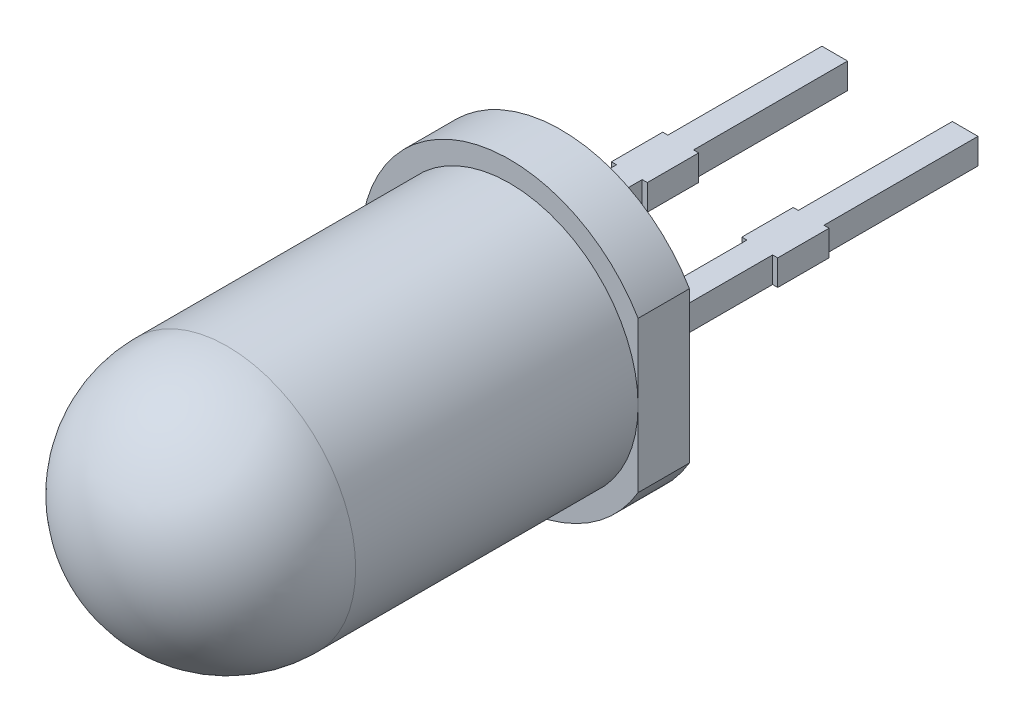
ISO-10303-21;
HEADER;
FILE_DESCRIPTION(('STEP AP214'),'2;1');
FILE_NAME('part.step','',(''),(''),'','','');
FILE_SCHEMA(('AUTOMOTIVE_DESIGN { 1 0 10303 214 1 1 1 1 }'));
ENDSEC;
DATA;
#1=APPLICATION_CONTEXT('core data for automotive mechanical design processes');
#2=APPLICATION_PROTOCOL_DEFINITION('international standard','automotive_design',2000,#1);
#3=PRODUCT_CONTEXT('',#1,'mechanical');
#4=PRODUCT('Part','Part','',(#3));
#5=PRODUCT_RELATED_PRODUCT_CATEGORY('part','',(#4));
#6=PRODUCT_DEFINITION_FORMATION('','',#4);
#7=PRODUCT_DEFINITION_CONTEXT('part definition',#1,'design');
#8=PRODUCT_DEFINITION('design','',#6,#7);
#9=PRODUCT_DEFINITION_SHAPE('','',#8);
#10=(LENGTH_UNIT() NAMED_UNIT(*) SI_UNIT(.MILLI.,.METRE.));
#11=(NAMED_UNIT(*) PLANE_ANGLE_UNIT() SI_UNIT($,.RADIAN.));
#12=(NAMED_UNIT(*) SI_UNIT($,.STERADIAN.) SOLID_ANGLE_UNIT());
#13=UNCERTAINTY_MEASURE_WITH_UNIT(LENGTH_MEASURE(1.E-05),#10,'distance_accuracy_value','');
#14=(GEOMETRIC_REPRESENTATION_CONTEXT(3) GLOBAL_UNCERTAINTY_ASSIGNED_CONTEXT((#13)) GLOBAL_UNIT_ASSIGNED_CONTEXT((#10,
#11,#12)) REPRESENTATION_CONTEXT('',''));
#15=CARTESIAN_POINT('',(0.,0.,0.));
#16=DIRECTION('',(0.,0.,1.));
#17=DIRECTION('',(1.,0.,0.));
#18=AXIS2_PLACEMENT_3D('',#15,#16,#17);
#19=CARTESIAN_POINT('',(-1.52,-0.25,3.6));
#20=DIRECTION('',(1.,0.,0.));
#21=DIRECTION('',(0.,0.,-1.));
#22=AXIS2_PLACEMENT_3D('',#19,#20,#21);
#23=PLANE('',#22);
#24=DIRECTION('',(0.,0.,-1.));
#25=VECTOR('',#24,1.);
#26=CARTESIAN_POINT('',(-1.52,0.25,3.6));
#27=LINE('',#26,#25);
#28=CARTESIAN_POINT('',(-1.52,0.25,3.6));
#29=VERTEX_POINT('',#28);
#30=CARTESIAN_POINT('',(-1.52,0.25,0.999999999999999));
#31=VERTEX_POINT('',#30);
#32=EDGE_CURVE('E231',#29,#31,#27,.T.);
#33=ORIENTED_EDGE('',*,*,#32,.T.);
#34=DIRECTION('',(0.,1.,0.));
#35=VECTOR('',#34,1.);
#36=CARTESIAN_POINT('',(-1.52,-0.25,0.999999999999999));
#37=LINE('',#36,#35);
#38=CARTESIAN_POINT('',(-1.52,-0.25,0.999999999999999));
#39=VERTEX_POINT('',#38);
#40=EDGE_CURVE('E42',#39,#31,#37,.T.);
#41=ORIENTED_EDGE('',*,*,#40,.F.);
#42=DIRECTION('',(0.,0.,-1.));
#43=VECTOR('',#42,1.);
#44=CARTESIAN_POINT('',(-1.52,-0.25,3.6));
#45=LINE('',#44,#43);
#46=CARTESIAN_POINT('',(-1.52,-0.25,3.6));
#47=VERTEX_POINT('',#46);
#48=EDGE_CURVE('E240',#47,#39,#45,.T.);
#49=ORIENTED_EDGE('',*,*,#48,.F.);
#50=DIRECTION('',(0.,1.,0.));
#51=VECTOR('',#50,1.);
#52=CARTESIAN_POINT('',(-1.52,-0.25,3.6));
#53=LINE('',#52,#51);
#54=EDGE_CURVE('E11',#47,#29,#53,.T.);
#55=ORIENTED_EDGE('',*,*,#54,.T.);
#56=EDGE_LOOP('',(#33,#41,#49,#55));
#57=FACE_BOUND('',#56,.T.);
#58=ADVANCED_FACE('F35',(#57),#23,.F.);
#59=CARTESIAN_POINT('',(-1.52,-0.25,0.999999999999999));
#60=DIRECTION('',(0.,0.,-1.));
#61=DIRECTION('',(-1.,0.,0.));
#62=AXIS2_PLACEMENT_3D('',#59,#60,#61);
#63=PLANE('',#62);
#64=DIRECTION('',(-1.,0.,0.));
#65=VECTOR('',#64,1.);
#66=CARTESIAN_POINT('',(-1.52,0.25,0.999999999999999));
#67=LINE('',#66,#65);
#68=CARTESIAN_POINT('',(-1.62,0.25,0.999999999999999));
#69=VERTEX_POINT('',#68);
#70=EDGE_CURVE('E265',#31,#69,#67,.T.);
#71=ORIENTED_EDGE('',*,*,#70,.T.);
#72=DIRECTION('',(0.,1.,0.));
#73=VECTOR('',#72,1.);
#74=CARTESIAN_POINT('',(-1.62,-0.25,0.999999999999999));
#75=LINE('',#74,#73);
#76=CARTESIAN_POINT('',(-1.62,-0.25,0.999999999999999));
#77=VERTEX_POINT('',#76);
#78=EDGE_CURVE('E311',#77,#69,#75,.T.);
#79=ORIENTED_EDGE('',*,*,#78,.F.);
#80=DIRECTION('',(-1.,0.,0.));
#81=VECTOR('',#80,1.);
#82=CARTESIAN_POINT('',(-1.52,-0.25,0.999999999999999));
#83=LINE('',#82,#81);
#84=EDGE_CURVE('E243',#39,#77,#83,.T.);
#85=ORIENTED_EDGE('',*,*,#84,.F.);
#86=ORIENTED_EDGE('',*,*,#40,.T.);
#87=EDGE_LOOP('',(#71,#79,#85,#86));
#88=FACE_BOUND('',#87,.T.);
#89=ADVANCED_FACE('F318',(#88),#63,.F.);
#90=CARTESIAN_POINT('',(-1.62,-0.25,0.999999999999999));
#91=DIRECTION('',(1.,0.,0.));
#92=DIRECTION('',(0.,0.,-1.));
#93=AXIS2_PLACEMENT_3D('',#90,#91,#92);
#94=PLANE('',#93);
#95=DIRECTION('',(0.,0.,-1.));
#96=VECTOR('',#95,1.);
#97=CARTESIAN_POINT('',(-1.62,0.25,0.999999999999999));
#98=LINE('',#97,#96);
#99=CARTESIAN_POINT('',(-1.62,0.25,0.));
#100=VERTEX_POINT('',#99);
#101=EDGE_CURVE('E267',#69,#100,#98,.T.);
#102=ORIENTED_EDGE('',*,*,#101,.T.);
#103=DIRECTION('',(0.,1.,0.));
#104=VECTOR('',#103,1.);
#105=CARTESIAN_POINT('',(-1.62,-0.25,0.));
#106=LINE('',#105,#104);
#107=CARTESIAN_POINT('',(-1.62,-0.25,0.));
#108=VERTEX_POINT('',#107);
#109=EDGE_CURVE('E308',#108,#100,#106,.T.);
#110=ORIENTED_EDGE('',*,*,#109,.F.);
#111=DIRECTION('',(0.,0.,-1.));
#112=VECTOR('',#111,1.);
#113=CARTESIAN_POINT('',(-1.62,-0.25,0.999999999999999));
#114=LINE('',#113,#112);
#115=EDGE_CURVE('E245',#77,#108,#114,.T.);
#116=ORIENTED_EDGE('',*,*,#115,.F.);
#117=ORIENTED_EDGE('',*,*,#78,.T.);
#118=EDGE_LOOP('',(#102,#110,#116,#117));
#119=FACE_BOUND('',#118,.T.);
#120=ADVANCED_FACE('F328',(#119),#94,.F.);
#121=CARTESIAN_POINT('',(-1.62,-0.25,0.));
#122=DIRECTION('',(0.,0.,1.));
#123=DIRECTION('',(1.,0.,0.));
#124=AXIS2_PLACEMENT_3D('',#121,#122,#123);
#125=PLANE('',#124);
#126=DIRECTION('',(1.,0.,0.));
#127=VECTOR('',#126,1.);
#128=CARTESIAN_POINT('',(-1.62,0.25,0.));
#129=LINE('',#128,#127);
#130=CARTESIAN_POINT('',(-1.52,0.25,0.));
#131=VERTEX_POINT('',#130);
#132=EDGE_CURVE('E269',#100,#131,#129,.T.);
#133=ORIENTED_EDGE('',*,*,#132,.T.);
#134=DIRECTION('',(0.,1.,0.));
#135=VECTOR('',#134,1.);
#136=CARTESIAN_POINT('',(-1.52,-0.25,0.));
#137=LINE('',#136,#135);
#138=CARTESIAN_POINT('',(-1.52,-0.25,0.));
#139=VERTEX_POINT('',#138);
#140=EDGE_CURVE('E305',#139,#131,#137,.T.);
#141=ORIENTED_EDGE('',*,*,#140,.F.);
#142=DIRECTION('',(1.,0.,0.));
#143=VECTOR('',#142,1.);
#144=CARTESIAN_POINT('',(-1.62,-0.25,0.));
#145=LINE('',#144,#143);
#146=EDGE_CURVE('E247',#108,#139,#145,.T.);
#147=ORIENTED_EDGE('',*,*,#146,.F.);
#148=ORIENTED_EDGE('',*,*,#109,.T.);
#149=EDGE_LOOP('',(#133,#141,#147,#148));
#150=FACE_BOUND('',#149,.T.);
#151=ADVANCED_FACE('F332',(#150),#125,.F.);
#152=CARTESIAN_POINT('',(-1.52,-0.25,0.));
#153=DIRECTION('',(1.,0.,0.));
#154=DIRECTION('',(0.,0.,-1.));
#155=AXIS2_PLACEMENT_3D('',#152,#153,#154);
#156=PLANE('',#155);
#157=DIRECTION('',(0.,0.,-1.));
#158=VECTOR('',#157,1.);
#159=CARTESIAN_POINT('',(-1.52,0.25,0.));
#160=LINE('',#159,#158);
#161=CARTESIAN_POINT('',(-1.52,0.25,-3.));
#162=VERTEX_POINT('',#161);
#163=EDGE_CURVE('E271',#131,#162,#160,.T.);
#164=ORIENTED_EDGE('',*,*,#163,.T.);
#165=DIRECTION('',(0.,1.,0.));
#166=VECTOR('',#165,1.);
#167=CARTESIAN_POINT('',(-1.52,-0.25,-3.));
#168=LINE('',#167,#166);
#169=CARTESIAN_POINT('',(-1.52,-0.25,-3.));
#170=VERTEX_POINT('',#169);
#171=EDGE_CURVE('E302',#170,#162,#168,.T.);
#172=ORIENTED_EDGE('',*,*,#171,.F.);
#173=DIRECTION('',(0.,0.,-1.));
#174=VECTOR('',#173,1.);
#175=CARTESIAN_POINT('',(-1.52,-0.25,0.));
#176=LINE('',#175,#174);
#177=EDGE_CURVE('E249',#139,#170,#176,.T.);
#178=ORIENTED_EDGE('',*,*,#177,.F.);
#179=ORIENTED_EDGE('',*,*,#140,.T.);
#180=EDGE_LOOP('',(#164,#172,#178,#179));
#181=FACE_BOUND('',#180,.T.);
#182=ADVANCED_FACE('F372',(#181),#156,.F.);
#183=CARTESIAN_POINT('',(-1.52,-0.25,-3.));
#184=DIRECTION('',(0.,0.,1.));
#185=DIRECTION('',(1.,0.,0.));
#186=AXIS2_PLACEMENT_3D('',#183,#184,#185);
#187=PLANE('',#186);
#188=DIRECTION('',(1.,0.,0.));
#189=VECTOR('',#188,1.);
#190=CARTESIAN_POINT('',(-1.52,0.25,-3.));
#191=LINE('',#190,#189);
#192=CARTESIAN_POINT('',(-1.02,0.25,-3.));
#193=VERTEX_POINT('',#192);
#194=EDGE_CURVE('E273',#162,#193,#191,.T.);
#195=ORIENTED_EDGE('',*,*,#194,.T.);
#196=DIRECTION('',(0.,1.,0.));
#197=VECTOR('',#196,1.);
#198=CARTESIAN_POINT('',(-1.02,-0.25,-3.));
#199=LINE('',#198,#197);
#200=CARTESIAN_POINT('',(-1.02,-0.25,-3.));
#201=VERTEX_POINT('',#200);
#202=EDGE_CURVE('E299',#201,#193,#199,.T.);
#203=ORIENTED_EDGE('',*,*,#202,.F.);
#204=DIRECTION('',(1.,0.,0.));
#205=VECTOR('',#204,1.);
#206=CARTESIAN_POINT('',(-1.52,-0.25,-3.));
#207=LINE('',#206,#205);
#208=EDGE_CURVE('E251',#170,#201,#207,.T.);
#209=ORIENTED_EDGE('',*,*,#208,.F.);
#210=ORIENTED_EDGE('',*,*,#171,.T.);
#211=EDGE_LOOP('',(#195,#203,#209,#210));
#212=FACE_BOUND('',#211,.T.);
#213=ADVANCED_FACE('F369',(#212),#187,.F.);
#214=CARTESIAN_POINT('',(-1.02,-0.25,0.));
#215=DIRECTION('',(-1.,0.,0.));
#216=DIRECTION('',(0.,0.,1.));
#217=AXIS2_PLACEMENT_3D('',#214,#215,#216);
#218=PLANE('',#217);
#219=DIRECTION('',(0.,0.,1.));
#220=VECTOR('',#219,1.);
#221=CARTESIAN_POINT('',(-1.02,0.25,0.));
#222=LINE('',#221,#220);
#223=CARTESIAN_POINT('',(-1.02,0.25,0.));
#224=VERTEX_POINT('',#223);
#225=EDGE_CURVE('E275',#193,#224,#222,.T.);
#226=ORIENTED_EDGE('',*,*,#225,.T.);
#227=DIRECTION('',(0.,1.,0.));
#228=VECTOR('',#227,1.);
#229=CARTESIAN_POINT('',(-1.02,-0.25,0.));
#230=LINE('',#229,#228);
#231=CARTESIAN_POINT('',(-1.02,-0.25,0.));
#232=VERTEX_POINT('',#231);
#233=EDGE_CURVE('E296',#232,#224,#230,.T.);
#234=ORIENTED_EDGE('',*,*,#233,.F.);
#235=DIRECTION('',(0.,0.,1.));
#236=VECTOR('',#235,1.);
#237=CARTESIAN_POINT('',(-1.02,-0.25,0.));
#238=LINE('',#237,#236);
#239=EDGE_CURVE('E253',#201,#232,#238,.T.);
#240=ORIENTED_EDGE('',*,*,#239,.F.);
#241=ORIENTED_EDGE('',*,*,#202,.T.);
#242=EDGE_LOOP('',(#226,#234,#240,#241));
#243=FACE_BOUND('',#242,.T.);
#244=ADVANCED_FACE('F365',(#243),#218,.F.);
#245=CARTESIAN_POINT('',(-0.92,-0.25,0.));
#246=DIRECTION('',(0.,0.,1.));
#247=DIRECTION('',(1.,0.,0.));
#248=AXIS2_PLACEMENT_3D('',#245,#246,#247);
#249=PLANE('',#248);
#250=DIRECTION('',(1.,0.,0.));
#251=VECTOR('',#250,1.);
#252=CARTESIAN_POINT('',(-0.92,0.25,0.));
#253=LINE('',#252,#251);
#254=CARTESIAN_POINT('',(-0.92,0.25,0.));
#255=VERTEX_POINT('',#254);
#256=EDGE_CURVE('E277',#224,#255,#253,.T.);
#257=ORIENTED_EDGE('',*,*,#256,.T.);
#258=DIRECTION('',(0.,1.,0.));
#259=VECTOR('',#258,1.);
#260=CARTESIAN_POINT('',(-0.92,-0.25,0.));
#261=LINE('',#260,#259);
#262=CARTESIAN_POINT('',(-0.92,-0.25,0.));
#263=VERTEX_POINT('',#262);
#264=EDGE_CURVE('E293',#263,#255,#261,.T.);
#265=ORIENTED_EDGE('',*,*,#264,.F.);
#266=DIRECTION('',(1.,0.,0.));
#267=VECTOR('',#266,1.);
#268=CARTESIAN_POINT('',(-0.92,-0.25,0.));
#269=LINE('',#268,#267);
#270=EDGE_CURVE('E255',#232,#263,#269,.T.);
#271=ORIENTED_EDGE('',*,*,#270,.F.);
#272=ORIENTED_EDGE('',*,*,#233,.T.);
#273=EDGE_LOOP('',(#257,#265,#271,#272));
#274=FACE_BOUND('',#273,.T.);
#275=ADVANCED_FACE('F361',(#274),#249,.F.);
#276=CARTESIAN_POINT('',(-0.919999999999999,-0.25,0.999999999999999));
#277=DIRECTION('',(-1.,0.,0.));
#278=DIRECTION('',(0.,0.,1.));
#279=AXIS2_PLACEMENT_3D('',#276,#277,#278);
#280=PLANE('',#279);
#281=DIRECTION('',(0.,0.,1.));
#282=VECTOR('',#281,1.);
#283=CARTESIAN_POINT('',(-0.919999999999999,0.25,0.999999999999999));
#284=LINE('',#283,#282);
#285=CARTESIAN_POINT('',(-0.919999999999999,0.25,0.999999999999999));
#286=VERTEX_POINT('',#285);
#287=EDGE_CURVE('E279',#255,#286,#284,.T.);
#288=ORIENTED_EDGE('',*,*,#287,.T.);
#289=DIRECTION('',(0.,1.,0.));
#290=VECTOR('',#289,1.);
#291=CARTESIAN_POINT('',(-0.919999999999999,-0.25,0.999999999999999));
#292=LINE('',#291,#290);
#293=CARTESIAN_POINT('',(-0.919999999999999,-0.25,0.999999999999999));
#294=VERTEX_POINT('',#293);
#295=EDGE_CURVE('E290',#294,#286,#292,.T.);
#296=ORIENTED_EDGE('',*,*,#295,.F.);
#297=DIRECTION('',(0.,0.,1.));
#298=VECTOR('',#297,1.);
#299=CARTESIAN_POINT('',(-0.919999999999999,-0.25,0.999999999999999));
#300=LINE('',#299,#298);
#301=EDGE_CURVE('E257',#263,#294,#300,.T.);
#302=ORIENTED_EDGE('',*,*,#301,.F.);
#303=ORIENTED_EDGE('',*,*,#264,.T.);
#304=EDGE_LOOP('',(#288,#296,#302,#303));
#305=FACE_BOUND('',#304,.T.);
#306=ADVANCED_FACE('F356',(#305),#280,.F.);
#307=CARTESIAN_POINT('',(-1.02,-0.25,0.999999999999999));
#308=DIRECTION('',(0.,0.,-1.));
#309=DIRECTION('',(-1.,0.,0.));
#310=AXIS2_PLACEMENT_3D('',#307,#308,#309);
#311=PLANE('',#310);
#312=DIRECTION('',(-1.,0.,0.));
#313=VECTOR('',#312,1.);
#314=CARTESIAN_POINT('',(-1.02,0.25,0.999999999999999));
#315=LINE('',#314,#313);
#316=CARTESIAN_POINT('',(-1.02,0.25,0.999999999999999));
#317=VERTEX_POINT('',#316);
#318=EDGE_CURVE('E281',#286,#317,#315,.T.);
#319=ORIENTED_EDGE('',*,*,#318,.T.);
#320=DIRECTION('',(0.,1.,0.));
#321=VECTOR('',#320,1.);
#322=CARTESIAN_POINT('',(-1.02,-0.25,0.999999999999999));
#323=LINE('',#322,#321);
#324=CARTESIAN_POINT('',(-1.02,-0.25,0.999999999999999));
#325=VERTEX_POINT('',#324);
#326=EDGE_CURVE('E287',#325,#317,#323,.T.);
#327=ORIENTED_EDGE('',*,*,#326,.F.);
#328=DIRECTION('',(-1.,0.,0.));
#329=VECTOR('',#328,1.);
#330=CARTESIAN_POINT('',(-1.02,-0.25,0.999999999999999));
#331=LINE('',#330,#329);
#332=EDGE_CURVE('E259',#294,#325,#331,.T.);
#333=ORIENTED_EDGE('',*,*,#332,.F.);
#334=ORIENTED_EDGE('',*,*,#295,.T.);
#335=EDGE_LOOP('',(#319,#327,#333,#334));
#336=FACE_BOUND('',#335,.T.);
#337=ADVANCED_FACE('F350',(#336),#311,.F.);
#338=CARTESIAN_POINT('',(-1.02,-0.25,3.6));
#339=DIRECTION('',(-1.,0.,0.));
#340=DIRECTION('',(0.,0.,1.));
#341=AXIS2_PLACEMENT_3D('',#338,#339,#340);
#342=PLANE('',#341);
#343=DIRECTION('',(0.,0.,1.));
#344=VECTOR('',#343,1.);
#345=CARTESIAN_POINT('',(-1.02,0.25,3.6));
#346=LINE('',#345,#344);
#347=CARTESIAN_POINT('',(-1.02,0.25,3.6));
#348=VERTEX_POINT('',#347);
#349=EDGE_CURVE('E241',#317,#348,#346,.T.);
#350=ORIENTED_EDGE('',*,*,#349,.T.);
#351=DIRECTION('',(0.,1.,0.));
#352=VECTOR('',#351,1.);
#353=CARTESIAN_POINT('',(-1.02,-0.25,3.6));
#354=LINE('',#353,#352);
#355=CARTESIAN_POINT('',(-1.02,-0.25,3.6));
#356=VERTEX_POINT('',#355);
#357=EDGE_CURVE('E262',#356,#348,#354,.T.);
#358=ORIENTED_EDGE('',*,*,#357,.F.);
#359=DIRECTION('',(0.,0.,1.));
#360=VECTOR('',#359,1.);
#361=CARTESIAN_POINT('',(-1.02,-0.25,3.6));
#362=LINE('',#361,#360);
#363=EDGE_CURVE('E261',#325,#356,#362,.T.);
#364=ORIENTED_EDGE('',*,*,#363,.F.);
#365=ORIENTED_EDGE('',*,*,#326,.T.);
#366=EDGE_LOOP('',(#350,#358,#364,#365));
#367=FACE_BOUND('',#366,.T.);
#368=ADVANCED_FACE('F345',(#367),#342,.F.);
#369=CARTESIAN_POINT('',(0.,-0.25,0.));
#370=DIRECTION('',(0.,1.,0.));
#371=DIRECTION('',(0.,0.,1.));
#372=AXIS2_PLACEMENT_3D('',#369,#370,#371);
#373=PLANE('',#372);
#374=DIRECTION('',(-1.,0.,0.));
#375=VECTOR('',#374,1.);
#376=CARTESIAN_POINT('',(-1.52,-0.25,3.6));
#377=LINE('',#376,#375);
#378=EDGE_CURVE('E237',#356,#47,#377,.T.);
#379=ORIENTED_EDGE('',*,*,#378,.T.);
#380=ORIENTED_EDGE('',*,*,#48,.T.);
#381=ORIENTED_EDGE('',*,*,#84,.T.);
#382=ORIENTED_EDGE('',*,*,#115,.T.);
#383=ORIENTED_EDGE('',*,*,#146,.T.);
#384=ORIENTED_EDGE('',*,*,#177,.T.);
#385=ORIENTED_EDGE('',*,*,#208,.T.);
#386=ORIENTED_EDGE('',*,*,#239,.T.);
#387=ORIENTED_EDGE('',*,*,#270,.T.);
#388=ORIENTED_EDGE('',*,*,#301,.T.);
#389=ORIENTED_EDGE('',*,*,#332,.T.);
#390=ORIENTED_EDGE('',*,*,#363,.T.);
#391=EDGE_LOOP('',(#379,#380,#381,#382,#383,#384,#385,#386,#387,#388,#389,#390));
#392=FACE_BOUND('',#391,.T.);
#393=ADVANCED_FACE('F336',(#392),#373,.F.);
#394=CARTESIAN_POINT('',(0.,0.25,0.));
#395=DIRECTION('',(0.,1.,0.));
#396=DIRECTION('',(0.,0.,1.));
#397=AXIS2_PLACEMENT_3D('',#394,#395,#396);
#398=PLANE('',#397);
#399=DIRECTION('',(-1.,0.,0.));
#400=VECTOR('',#399,1.);
#401=CARTESIAN_POINT('',(-1.52,0.25,3.6));
#402=LINE('',#401,#400);
#403=EDGE_CURVE('E227',#348,#29,#402,.T.);
#404=ORIENTED_EDGE('',*,*,#403,.F.);
#405=ORIENTED_EDGE('',*,*,#349,.F.);
#406=ORIENTED_EDGE('',*,*,#318,.F.);
#407=ORIENTED_EDGE('',*,*,#287,.F.);
#408=ORIENTED_EDGE('',*,*,#256,.F.);
#409=ORIENTED_EDGE('',*,*,#225,.F.);
#410=ORIENTED_EDGE('',*,*,#194,.F.);
#411=ORIENTED_EDGE('',*,*,#163,.F.);
#412=ORIENTED_EDGE('',*,*,#132,.F.);
#413=ORIENTED_EDGE('',*,*,#101,.F.);
#414=ORIENTED_EDGE('',*,*,#70,.F.);
#415=ORIENTED_EDGE('',*,*,#32,.F.);
#416=EDGE_LOOP('',(#404,#405,#406,#407,#408,#409,#410,#411,#412,#413,#414,#415));
#417=FACE_BOUND('',#416,.T.);
#418=ADVANCED_FACE('F323',(#417),#398,.T.);
#419=CARTESIAN_POINT('',(2.9,0.,3.6));
#420=DIRECTION('',(0.,0.,-1.));
#421=DIRECTION('',(-1.,0.,0.));
#422=AXIS2_PLACEMENT_3D('',#419,#420,#421);
#423=PLANE('',#422);
#424=DIRECTION('',(0.,-1.,0.));
#425=VECTOR('',#424,1.);
#426=CARTESIAN_POINT('',(2.5,1.4696938456699,3.6));
#427=LINE('',#426,#425);
#428=CARTESIAN_POINT('',(2.5,1.4696938456699,3.6));
#429=VERTEX_POINT('',#428);
#430=CARTESIAN_POINT('',(2.5,-1.4696938456699,3.6));
#431=VERTEX_POINT('',#430);
#432=EDGE_CURVE('E211',#429,#431,#427,.T.);
#433=ORIENTED_EDGE('',*,*,#432,.T.);
#434=CARTESIAN_POINT('',(0.,0.,3.6));
#435=DIRECTION('',(0.,0.,1.));
#436=DIRECTION('',(1.,0.,0.));
#437=AXIS2_PLACEMENT_3D('',#434,#435,#436);
#438=CIRCLE('',#437,2.9);
#439=EDGE_CURVE('E224',#429,#431,#438,.T.);
#440=ORIENTED_EDGE('',*,*,#439,.F.);
#441=EDGE_LOOP('',(#433,#440));
#442=FACE_BOUND('',#441,.T.);
#443=DIRECTION('',(-1.,0.,0.));
#444=VECTOR('',#443,1.);
#445=CARTESIAN_POINT('',(1.02,-0.25,3.6));
#446=LINE('',#445,#444);
#447=CARTESIAN_POINT('',(1.52,-0.25,3.6));
#448=VERTEX_POINT('',#447);
#449=CARTESIAN_POINT('',(1.02,-0.25,3.6));
#450=VERTEX_POINT('',#449);
#451=EDGE_CURVE('E742',#448,#450,#446,.T.);
#452=ORIENTED_EDGE('',*,*,#451,.F.);
#453=DIRECTION('',(0.,1.,0.));
#454=VECTOR('',#453,1.);
#455=CARTESIAN_POINT('',(1.52,-0.25,3.6));
#456=LINE('',#455,#454);
#457=CARTESIAN_POINT('',(1.52,0.25,3.6));
#458=VERTEX_POINT('',#457);
#459=EDGE_CURVE('E659',#448,#458,#456,.T.);
#460=ORIENTED_EDGE('',*,*,#459,.T.);
#461=DIRECTION('',(-1.,0.,0.));
#462=VECTOR('',#461,1.);
#463=CARTESIAN_POINT('',(1.02,0.25,3.6));
#464=LINE('',#463,#462);
#465=CARTESIAN_POINT('',(1.02,0.25,3.6));
#466=VERTEX_POINT('',#465);
#467=EDGE_CURVE('E717',#458,#466,#464,.T.);
#468=ORIENTED_EDGE('',*,*,#467,.T.);
#469=DIRECTION('',(0.,1.,0.));
#470=VECTOR('',#469,1.);
#471=CARTESIAN_POINT('',(1.02,-0.25,3.6));
#472=LINE('',#471,#470);
#473=EDGE_CURVE('E662',#450,#466,#472,.T.);
#474=ORIENTED_EDGE('',*,*,#473,.F.);
#475=EDGE_LOOP('',(#452,#460,#468,#474));
#476=FACE_BOUND('',#475,.T.);
#477=ORIENTED_EDGE('',*,*,#357,.T.);
#478=ORIENTED_EDGE('',*,*,#403,.T.);
#479=ORIENTED_EDGE('',*,*,#54,.F.);
#480=ORIENTED_EDGE('',*,*,#378,.F.);
#481=EDGE_LOOP('',(#477,#478,#479,#480));
#482=FACE_BOUND('',#481,.T.);
#483=ADVANCED_FACE('F222',(#442,#476,#482),#423,.T.);
#484=CARTESIAN_POINT('',(0.,0.,3.6));
#485=DIRECTION('',(0.,0.,1.));
#486=DIRECTION('',(1.,0.,0.));
#487=AXIS2_PLACEMENT_3D('',#484,#485,#486);
#488=CYLINDRICAL_SURFACE('',#487,2.9);
#489=DIRECTION('',(0.,0.,1.));
#490=VECTOR('',#489,1.);
#491=CARTESIAN_POINT('',(2.5,-1.4696938456699,0.633520605161741));
#492=LINE('',#491,#490);
#493=CARTESIAN_POINT('',(2.5,-1.4696938456699,4.6));
#494=VERTEX_POINT('',#493);
#495=EDGE_CURVE('E208',#431,#494,#492,.T.);
#496=ORIENTED_EDGE('',*,*,#495,.T.);
#497=CARTESIAN_POINT('',(0.,0.,4.6));
#498=DIRECTION('',(0.,0.,1.));
#499=DIRECTION('',(1.,0.,0.));
#500=AXIS2_PLACEMENT_3D('',#497,#498,#499);
#501=CIRCLE('',#500,2.9);
#502=CARTESIAN_POINT('',(2.5,1.4696938456699,4.6));
#503=VERTEX_POINT('',#502);
#504=EDGE_CURVE('E228',#503,#494,#501,.T.);
#505=ORIENTED_EDGE('',*,*,#504,.F.);
#506=DIRECTION('',(0.,0.,1.));
#507=VECTOR('',#506,1.);
#508=CARTESIAN_POINT('',(2.5,1.4696938456699,0.633520605161741));
#509=LINE('',#508,#507);
#510=EDGE_CURVE('E218',#429,#503,#509,.T.);
#511=ORIENTED_EDGE('',*,*,#510,.F.);
#512=ORIENTED_EDGE('',*,*,#439,.T.);
#513=EDGE_LOOP('',(#496,#505,#511,#512));
#514=FACE_BOUND('',#513,.T.);
#515=ADVANCED_FACE('F226',(#514),#488,.T.);
#516=CARTESIAN_POINT('',(2.5,0.,4.6));
#517=DIRECTION('',(0.,0.,1.));
#518=DIRECTION('',(1.,0.,0.));
#519=AXIS2_PLACEMENT_3D('',#516,#517,#518);
#520=PLANE('',#519);
#521=DIRECTION('',(0.,-1.,0.));
#522=VECTOR('',#521,1.);
#523=CARTESIAN_POINT('',(2.5,1.4696938456699,4.6));
#524=LINE('',#523,#522);
#525=CARTESIAN_POINT('',(2.5,0.,4.6));
#526=VERTEX_POINT('',#525);
#527=EDGE_CURVE('E49',#503,#526,#524,.T.);
#528=ORIENTED_EDGE('',*,*,#527,.F.);
#529=ORIENTED_EDGE('',*,*,#504,.T.);
#530=EDGE_CURVE('E213',#526,#494,#524,.T.);
#531=ORIENTED_EDGE('',*,*,#530,.F.);
#532=CARTESIAN_POINT('',(0.,0.,4.6));
#533=DIRECTION('',(0.,0.,1.));
#534=DIRECTION('',(1.,0.,0.));
#535=AXIS2_PLACEMENT_3D('',#532,#533,#534);
#536=CIRCLE('',#535,2.5);
#537=EDGE_CURVE('E233',#526,#526,#536,.T.);
#538=ORIENTED_EDGE('',*,*,#537,.F.);
#539=EDGE_LOOP('',(#528,#529,#531,#538));
#540=FACE_BOUND('',#539,.T.);
#541=ADVANCED_FACE('F627',(#540),#520,.T.);
#542=CARTESIAN_POINT('',(0.,0.,3.6));
#543=DIRECTION('',(0.,0.,1.));
#544=DIRECTION('',(1.,0.,0.));
#545=AXIS2_PLACEMENT_3D('',#542,#543,#544);
#546=CYLINDRICAL_SURFACE('',#545,2.5);
#547=ORIENTED_EDGE('',*,*,#537,.T.);
#548=EDGE_LOOP('',(#547));
#549=FACE_BOUND('',#548,.T.);
#550=CARTESIAN_POINT('',(0.,0.,10.1));
#551=DIRECTION('',(0.,0.,1.));
#552=DIRECTION('',(1.,0.,0.));
#553=AXIS2_PLACEMENT_3D('',#550,#551,#552);
#554=CIRCLE('',#553,2.5);
#555=CARTESIAN_POINT('',(2.5,0.,10.1));
#556=VERTEX_POINT('',#555);
#557=EDGE_CURVE('E658',#556,#556,#554,.T.);
#558=ORIENTED_EDGE('',*,*,#557,.F.);
#559=EDGE_LOOP('',(#558));
#560=FACE_BOUND('',#559,.T.);
#561=ADVANCED_FACE('F479',(#549,#560),#546,.T.);
#562=CARTESIAN_POINT('',(0.,0.,10.1));
#563=DIRECTION('',(0.,0.,1.));
#564=DIRECTION('',(1.,0.,0.));
#565=AXIS2_PLACEMENT_3D('',#562,#563,#564);
#566=SPHERICAL_SURFACE('',#565,2.5);
#567=ORIENTED_EDGE('',*,*,#557,.T.);
#568=EDGE_LOOP('',(#567));
#569=FACE_BOUND('',#568,.T.);
#570=ADVANCED_FACE('F473',(#569),#566,.T.);
#571=CARTESIAN_POINT('',(1.52,-0.25,3.6));
#572=DIRECTION('',(-1.,0.,0.));
#573=DIRECTION('',(0.,0.,1.));
#574=AXIS2_PLACEMENT_3D('',#571,#572,#573);
#575=PLANE('',#574);
#576=DIRECTION('',(0.,0.,1.));
#577=VECTOR('',#576,1.);
#578=CARTESIAN_POINT('',(1.52,0.25,3.6));
#579=LINE('',#578,#577);
#580=CARTESIAN_POINT('',(1.52,0.25,0.999999999999999));
#581=VERTEX_POINT('',#580);
#582=EDGE_CURVE('E720',#581,#458,#579,.T.);
#583=ORIENTED_EDGE('',*,*,#582,.T.);
#584=ORIENTED_EDGE('',*,*,#459,.F.);
#585=DIRECTION('',(0.,0.,1.));
#586=VECTOR('',#585,1.);
#587=CARTESIAN_POINT('',(1.52,-0.25,3.6));
#588=LINE('',#587,#586);
#589=CARTESIAN_POINT('',(1.52,-0.25,0.999999999999999));
#590=VERTEX_POINT('',#589);
#591=EDGE_CURVE('E699',#590,#448,#588,.T.);
#592=ORIENTED_EDGE('',*,*,#591,.F.);
#593=DIRECTION('',(0.,1.,0.));
#594=VECTOR('',#593,1.);
#595=CARTESIAN_POINT('',(1.52,-0.25,0.999999999999999));
#596=LINE('',#595,#594);
#597=EDGE_CURVE('E693',#590,#581,#596,.T.);
#598=ORIENTED_EDGE('',*,*,#597,.T.);
#599=EDGE_LOOP('',(#583,#584,#592,#598));
#600=FACE_BOUND('',#599,.T.);
#601=ADVANCED_FACE('F478',(#600),#575,.F.);
#602=CARTESIAN_POINT('',(1.02,-0.25,3.6));
#603=DIRECTION('',(1.,0.,0.));
#604=DIRECTION('',(0.,0.,-1.));
#605=AXIS2_PLACEMENT_3D('',#602,#603,#604);
#606=PLANE('',#605);
#607=DIRECTION('',(0.,0.,-1.));
#608=VECTOR('',#607,1.);
#609=CARTESIAN_POINT('',(1.02,0.25,3.6));
#610=LINE('',#609,#608);
#611=CARTESIAN_POINT('',(1.02,0.25,0.999999999999999));
#612=VERTEX_POINT('',#611);
#613=EDGE_CURVE('E57',#466,#612,#610,.T.);
#614=ORIENTED_EDGE('',*,*,#613,.T.);
#615=DIRECTION('',(0.,1.,0.));
#616=VECTOR('',#615,1.);
#617=CARTESIAN_POINT('',(1.02,-0.25,0.999999999999999));
#618=LINE('',#617,#616);
#619=CARTESIAN_POINT('',(1.02,-0.25,0.999999999999999));
#620=VERTEX_POINT('',#619);
#621=EDGE_CURVE('E666',#620,#612,#618,.T.);
#622=ORIENTED_EDGE('',*,*,#621,.F.);
#623=DIRECTION('',(0.,0.,-1.));
#624=VECTOR('',#623,1.);
#625=CARTESIAN_POINT('',(1.02,-0.25,3.6));
#626=LINE('',#625,#624);
#627=EDGE_CURVE('E740',#450,#620,#626,.T.);
#628=ORIENTED_EDGE('',*,*,#627,.F.);
#629=ORIENTED_EDGE('',*,*,#473,.T.);
#630=EDGE_LOOP('',(#614,#622,#628,#629));
#631=FACE_BOUND('',#630,.T.);
#632=ADVANCED_FACE('F491',(#631),#606,.F.);
#633=CARTESIAN_POINT('',(1.02,-0.25,0.999999999999999));
#634=DIRECTION('',(0.,0.,-1.));
#635=DIRECTION('',(-1.,0.,0.));
#636=AXIS2_PLACEMENT_3D('',#633,#634,#635);
#637=PLANE('',#636);
#638=DIRECTION('',(-1.,0.,0.));
#639=VECTOR('',#638,1.);
#640=CARTESIAN_POINT('',(1.02,0.25,0.999999999999999));
#641=LINE('',#640,#639);
#642=CARTESIAN_POINT('',(0.919999999999999,0.25,0.999999999999999));
#643=VERTEX_POINT('',#642);
#644=EDGE_CURVE('E714',#612,#643,#641,.T.);
#645=ORIENTED_EDGE('',*,*,#644,.T.);
#646=DIRECTION('',(0.,1.,0.));
#647=VECTOR('',#646,1.);
#648=CARTESIAN_POINT('',(0.919999999999999,-0.25,0.999999999999999));
#649=LINE('',#648,#647);
#650=CARTESIAN_POINT('',(0.919999999999999,-0.25,0.999999999999999));
#651=VERTEX_POINT('',#650);
#652=EDGE_CURVE('E669',#651,#643,#649,.T.);
#653=ORIENTED_EDGE('',*,*,#652,.F.);
#654=DIRECTION('',(-1.,0.,0.));
#655=VECTOR('',#654,1.);
#656=CARTESIAN_POINT('',(1.02,-0.25,0.999999999999999));
#657=LINE('',#656,#655);
#658=EDGE_CURVE('E738',#620,#651,#657,.T.);
#659=ORIENTED_EDGE('',*,*,#658,.F.);
#660=ORIENTED_EDGE('',*,*,#621,.T.);
#661=EDGE_LOOP('',(#645,#653,#659,#660));
#662=FACE_BOUND('',#661,.T.);
#663=ADVANCED_FACE('F501',(#662),#637,.F.);
#664=CARTESIAN_POINT('',(0.919999999999999,-0.25,0.999999999999999));
#665=DIRECTION('',(1.,0.,0.));
#666=DIRECTION('',(0.,0.,-1.));
#667=AXIS2_PLACEMENT_3D('',#664,#665,#666);
#668=PLANE('',#667);
#669=DIRECTION('',(0.,0.,-1.));
#670=VECTOR('',#669,1.);
#671=CARTESIAN_POINT('',(0.919999999999999,0.25,0.999999999999999));
#672=LINE('',#671,#670);
#673=CARTESIAN_POINT('',(0.92,0.25,0.));
#674=VERTEX_POINT('',#673);
#675=EDGE_CURVE('E712',#643,#674,#672,.T.);
#676=ORIENTED_EDGE('',*,*,#675,.T.);
#677=DIRECTION('',(0.,1.,0.));
#678=VECTOR('',#677,1.);
#679=CARTESIAN_POINT('',(0.92,-0.25,0.));
#680=LINE('',#679,#678);
#681=CARTESIAN_POINT('',(0.92,-0.25,0.));
#682=VERTEX_POINT('',#681);
#683=EDGE_CURVE('E672',#682,#674,#680,.T.);
#684=ORIENTED_EDGE('',*,*,#683,.F.);
#685=DIRECTION('',(0.,0.,-1.));
#686=VECTOR('',#685,1.);
#687=CARTESIAN_POINT('',(0.919999999999999,-0.25,0.999999999999999));
#688=LINE('',#687,#686);
#689=EDGE_CURVE('E736',#651,#682,#688,.T.);
#690=ORIENTED_EDGE('',*,*,#689,.F.);
#691=ORIENTED_EDGE('',*,*,#652,.T.);
#692=EDGE_LOOP('',(#676,#684,#690,#691));
#693=FACE_BOUND('',#692,.T.);
#694=ADVANCED_FACE('F511',(#693),#668,.F.);
#695=CARTESIAN_POINT('',(0.92,-0.25,0.));
#696=DIRECTION('',(0.,0.,1.));
#697=DIRECTION('',(1.,0.,0.));
#698=AXIS2_PLACEMENT_3D('',#695,#696,#697);
#699=PLANE('',#698);
#700=DIRECTION('',(1.,0.,0.));
#701=VECTOR('',#700,1.);
#702=CARTESIAN_POINT('',(0.92,0.25,0.));
#703=LINE('',#702,#701);
#704=CARTESIAN_POINT('',(1.02,0.25,0.));
#705=VERTEX_POINT('',#704);
#706=EDGE_CURVE('E710',#674,#705,#703,.T.);
#707=ORIENTED_EDGE('',*,*,#706,.T.);
#708=DIRECTION('',(0.,1.,0.));
#709=VECTOR('',#708,1.);
#710=CARTESIAN_POINT('',(1.02,-0.25,0.));
#711=LINE('',#710,#709);
#712=CARTESIAN_POINT('',(1.02,-0.25,0.));
#713=VERTEX_POINT('',#712);
#714=EDGE_CURVE('E675',#713,#705,#711,.T.);
#715=ORIENTED_EDGE('',*,*,#714,.F.);
#716=DIRECTION('',(1.,0.,0.));
#717=VECTOR('',#716,1.);
#718=CARTESIAN_POINT('',(0.92,-0.25,0.));
#719=LINE('',#718,#717);
#720=EDGE_CURVE('E734',#682,#713,#719,.T.);
#721=ORIENTED_EDGE('',*,*,#720,.F.);
#722=ORIENTED_EDGE('',*,*,#683,.T.);
#723=EDGE_LOOP('',(#707,#715,#721,#722));
#724=FACE_BOUND('',#723,.T.);
#725=ADVANCED_FACE('F521',(#724),#699,.F.);
#726=CARTESIAN_POINT('',(1.02,-0.25,0.));
#727=DIRECTION('',(1.,0.,0.));
#728=DIRECTION('',(0.,0.,-1.));
#729=AXIS2_PLACEMENT_3D('',#726,#727,#728);
#730=PLANE('',#729);
#731=DIRECTION('',(0.,0.,-1.));
#732=VECTOR('',#731,1.);
#733=CARTESIAN_POINT('',(1.02,0.25,0.));
#734=LINE('',#733,#732);
#735=CARTESIAN_POINT('',(1.02,0.25,-3.));
#736=VERTEX_POINT('',#735);
#737=EDGE_CURVE('E708',#705,#736,#734,.T.);
#738=ORIENTED_EDGE('',*,*,#737,.T.);
#739=DIRECTION('',(0.,1.,0.));
#740=VECTOR('',#739,1.);
#741=CARTESIAN_POINT('',(1.02,-0.25,-3.));
#742=LINE('',#741,#740);
#743=CARTESIAN_POINT('',(1.02,-0.25,-3.));
#744=VERTEX_POINT('',#743);
#745=EDGE_CURVE('E678',#744,#736,#742,.T.);
#746=ORIENTED_EDGE('',*,*,#745,.F.);
#747=DIRECTION('',(0.,0.,-1.));
#748=VECTOR('',#747,1.);
#749=CARTESIAN_POINT('',(1.02,-0.25,0.));
#750=LINE('',#749,#748);
#751=EDGE_CURVE('E732',#713,#744,#750,.T.);
#752=ORIENTED_EDGE('',*,*,#751,.F.);
#753=ORIENTED_EDGE('',*,*,#714,.T.);
#754=EDGE_LOOP('',(#738,#746,#752,#753));
#755=FACE_BOUND('',#754,.T.);
#756=ADVANCED_FACE('F531',(#755),#730,.F.);
#757=CARTESIAN_POINT('',(1.52,-0.25,-3.));
#758=DIRECTION('',(0.,0.,1.));
#759=DIRECTION('',(1.,0.,0.));
#760=AXIS2_PLACEMENT_3D('',#757,#758,#759);
#761=PLANE('',#760);
#762=DIRECTION('',(1.,0.,0.));
#763=VECTOR('',#762,1.);
#764=CARTESIAN_POINT('',(1.52,0.25,-3.));
#765=LINE('',#764,#763);
#766=CARTESIAN_POINT('',(1.52,0.25,-3.));
#767=VERTEX_POINT('',#766);
#768=EDGE_CURVE('E706',#736,#767,#765,.T.);
#769=ORIENTED_EDGE('',*,*,#768,.T.);
#770=DIRECTION('',(0.,1.,0.));
#771=VECTOR('',#770,1.);
#772=CARTESIAN_POINT('',(1.52,-0.25,-3.));
#773=LINE('',#772,#771);
#774=CARTESIAN_POINT('',(1.52,-0.25,-3.));
#775=VERTEX_POINT('',#774);
#776=EDGE_CURVE('E681',#775,#767,#773,.T.);
#777=ORIENTED_EDGE('',*,*,#776,.F.);
#778=DIRECTION('',(1.,0.,0.));
#779=VECTOR('',#778,1.);
#780=CARTESIAN_POINT('',(1.52,-0.25,-3.));
#781=LINE('',#780,#779);
#782=EDGE_CURVE('E730',#744,#775,#781,.T.);
#783=ORIENTED_EDGE('',*,*,#782,.F.);
#784=ORIENTED_EDGE('',*,*,#745,.T.);
#785=EDGE_LOOP('',(#769,#777,#783,#784));
#786=FACE_BOUND('',#785,.T.);
#787=ADVANCED_FACE('F541',(#786),#761,.F.);
#788=CARTESIAN_POINT('',(1.52,-0.25,0.));
#789=DIRECTION('',(-1.,0.,0.));
#790=DIRECTION('',(0.,0.,1.));
#791=AXIS2_PLACEMENT_3D('',#788,#789,#790);
#792=PLANE('',#791);
#793=DIRECTION('',(0.,0.,1.));
#794=VECTOR('',#793,1.);
#795=CARTESIAN_POINT('',(1.52,0.25,0.));
#796=LINE('',#795,#794);
#797=CARTESIAN_POINT('',(1.52,0.25,0.));
#798=VERTEX_POINT('',#797);
#799=EDGE_CURVE('E704',#767,#798,#796,.T.);
#800=ORIENTED_EDGE('',*,*,#799,.T.);
#801=DIRECTION('',(0.,1.,0.));
#802=VECTOR('',#801,1.);
#803=CARTESIAN_POINT('',(1.52,-0.25,0.));
#804=LINE('',#803,#802);
#805=CARTESIAN_POINT('',(1.52,-0.25,0.));
#806=VERTEX_POINT('',#805);
#807=EDGE_CURVE('E684',#806,#798,#804,.T.);
#808=ORIENTED_EDGE('',*,*,#807,.F.);
#809=DIRECTION('',(0.,0.,1.));
#810=VECTOR('',#809,1.);
#811=CARTESIAN_POINT('',(1.52,-0.25,0.));
#812=LINE('',#811,#810);
#813=EDGE_CURVE('E728',#775,#806,#812,.T.);
#814=ORIENTED_EDGE('',*,*,#813,.F.);
#815=ORIENTED_EDGE('',*,*,#776,.T.);
#816=EDGE_LOOP('',(#800,#808,#814,#815));
#817=FACE_BOUND('',#816,.T.);
#818=ADVANCED_FACE('F551',(#817),#792,.F.);
#819=CARTESIAN_POINT('',(1.62,-0.25,0.));
#820=DIRECTION('',(0.,0.,1.));
#821=DIRECTION('',(1.,0.,0.));
#822=AXIS2_PLACEMENT_3D('',#819,#820,#821);
#823=PLANE('',#822);
#824=DIRECTION('',(1.,0.,0.));
#825=VECTOR('',#824,1.);
#826=CARTESIAN_POINT('',(1.62,0.25,0.));
#827=LINE('',#826,#825);
#828=CARTESIAN_POINT('',(1.62,0.25,0.));
#829=VERTEX_POINT('',#828);
#830=EDGE_CURVE('E702',#798,#829,#827,.T.);
#831=ORIENTED_EDGE('',*,*,#830,.T.);
#832=DIRECTION('',(0.,1.,0.));
#833=VECTOR('',#832,1.);
#834=CARTESIAN_POINT('',(1.62,-0.25,0.));
#835=LINE('',#834,#833);
#836=CARTESIAN_POINT('',(1.62,-0.25,0.));
#837=VERTEX_POINT('',#836);
#838=EDGE_CURVE('E687',#837,#829,#835,.T.);
#839=ORIENTED_EDGE('',*,*,#838,.F.);
#840=DIRECTION('',(1.,0.,0.));
#841=VECTOR('',#840,1.);
#842=CARTESIAN_POINT('',(1.62,-0.25,0.));
#843=LINE('',#842,#841);
#844=EDGE_CURVE('E726',#806,#837,#843,.T.);
#845=ORIENTED_EDGE('',*,*,#844,.F.);
#846=ORIENTED_EDGE('',*,*,#807,.T.);
#847=EDGE_LOOP('',(#831,#839,#845,#846));
#848=FACE_BOUND('',#847,.T.);
#849=ADVANCED_FACE('F561',(#848),#823,.F.);
#850=CARTESIAN_POINT('',(1.62,-0.25,0.999999999999999));
#851=DIRECTION('',(-1.,0.,0.));
#852=DIRECTION('',(0.,0.,1.));
#853=AXIS2_PLACEMENT_3D('',#850,#851,#852);
#854=PLANE('',#853);
#855=DIRECTION('',(0.,0.,1.));
#856=VECTOR('',#855,1.);
#857=CARTESIAN_POINT('',(1.62,0.25,0.999999999999999));
#858=LINE('',#857,#856);
#859=CARTESIAN_POINT('',(1.62,0.25,0.999999999999999));
#860=VERTEX_POINT('',#859);
#861=EDGE_CURVE('E700',#829,#860,#858,.T.);
#862=ORIENTED_EDGE('',*,*,#861,.T.);
#863=DIRECTION('',(0.,1.,0.));
#864=VECTOR('',#863,1.);
#865=CARTESIAN_POINT('',(1.62,-0.25,0.999999999999999));
#866=LINE('',#865,#864);
#867=CARTESIAN_POINT('',(1.62,-0.25,0.999999999999999));
#868=VERTEX_POINT('',#867);
#869=EDGE_CURVE('E690',#868,#860,#866,.T.);
#870=ORIENTED_EDGE('',*,*,#869,.F.);
#871=DIRECTION('',(0.,0.,1.));
#872=VECTOR('',#871,1.);
#873=CARTESIAN_POINT('',(1.62,-0.25,0.999999999999999));
#874=LINE('',#873,#872);
#875=EDGE_CURVE('E724',#837,#868,#874,.T.);
#876=ORIENTED_EDGE('',*,*,#875,.F.);
#877=ORIENTED_EDGE('',*,*,#838,.T.);
#878=EDGE_LOOP('',(#862,#870,#876,#877));
#879=FACE_BOUND('',#878,.T.);
#880=ADVANCED_FACE('F571',(#879),#854,.F.);
#881=CARTESIAN_POINT('',(1.52,-0.25,0.999999999999999));
#882=DIRECTION('',(0.,0.,-1.));
#883=DIRECTION('',(-1.,0.,0.));
#884=AXIS2_PLACEMENT_3D('',#881,#882,#883);
#885=PLANE('',#884);
#886=DIRECTION('',(-1.,0.,0.));
#887=VECTOR('',#886,1.);
#888=CARTESIAN_POINT('',(1.52,0.25,0.999999999999999));
#889=LINE('',#888,#887);
#890=EDGE_CURVE('E697',#860,#581,#889,.T.);
#891=ORIENTED_EDGE('',*,*,#890,.T.);
#892=ORIENTED_EDGE('',*,*,#597,.F.);
#893=DIRECTION('',(-1.,0.,0.));
#894=VECTOR('',#893,1.);
#895=CARTESIAN_POINT('',(1.52,-0.25,0.999999999999999));
#896=LINE('',#895,#894);
#897=EDGE_CURVE('E696',#868,#590,#896,.T.);
#898=ORIENTED_EDGE('',*,*,#897,.F.);
#899=ORIENTED_EDGE('',*,*,#869,.T.);
#900=EDGE_LOOP('',(#891,#892,#898,#899));
#901=FACE_BOUND('',#900,.T.);
#902=ADVANCED_FACE('F581',(#901),#885,.F.);
#903=CARTESIAN_POINT('',(0.,-0.25,0.));
#904=DIRECTION('',(0.,-1.,0.));
#905=DIRECTION('',(0.,0.,-1.));
#906=AXIS2_PLACEMENT_3D('',#903,#904,#905);
#907=PLANE('',#906);
#908=ORIENTED_EDGE('',*,*,#591,.T.);
#909=ORIENTED_EDGE('',*,*,#451,.T.);
#910=ORIENTED_EDGE('',*,*,#627,.T.);
#911=ORIENTED_EDGE('',*,*,#658,.T.);
#912=ORIENTED_EDGE('',*,*,#689,.T.);
#913=ORIENTED_EDGE('',*,*,#720,.T.);
#914=ORIENTED_EDGE('',*,*,#751,.T.);
#915=ORIENTED_EDGE('',*,*,#782,.T.);
#916=ORIENTED_EDGE('',*,*,#813,.T.);
#917=ORIENTED_EDGE('',*,*,#844,.T.);
#918=ORIENTED_EDGE('',*,*,#875,.T.);
#919=ORIENTED_EDGE('',*,*,#897,.T.);
#920=EDGE_LOOP('',(#908,#909,#910,#911,#912,#913,#914,#915,#916,#917,#918,#919));
#921=FACE_BOUND('',#920,.T.);
#922=ADVANCED_FACE('F591',(#921),#907,.T.);
#923=CARTESIAN_POINT('',(0.,0.25,0.));
#924=DIRECTION('',(0.,-1.,0.));
#925=DIRECTION('',(0.,0.,-1.));
#926=AXIS2_PLACEMENT_3D('',#923,#924,#925);
#927=PLANE('',#926);
#928=ORIENTED_EDGE('',*,*,#582,.F.);
#929=ORIENTED_EDGE('',*,*,#890,.F.);
#930=ORIENTED_EDGE('',*,*,#861,.F.);
#931=ORIENTED_EDGE('',*,*,#830,.F.);
#932=ORIENTED_EDGE('',*,*,#799,.F.);
#933=ORIENTED_EDGE('',*,*,#768,.F.);
#934=ORIENTED_EDGE('',*,*,#737,.F.);
#935=ORIENTED_EDGE('',*,*,#706,.F.);
#936=ORIENTED_EDGE('',*,*,#675,.F.);
#937=ORIENTED_EDGE('',*,*,#644,.F.);
#938=ORIENTED_EDGE('',*,*,#613,.F.);
#939=ORIENTED_EDGE('',*,*,#467,.F.);
#940=EDGE_LOOP('',(#928,#929,#930,#931,#932,#933,#934,#935,#936,#937,#938,#939));
#941=FACE_BOUND('',#940,.T.);
#942=ADVANCED_FACE('F601',(#941),#927,.F.);
#943=CARTESIAN_POINT('',(2.5,1.4696938456699,0.633520605161741));
#944=DIRECTION('',(-1.,0.,0.));
#945=DIRECTION('',(0.,0.,1.));
#946=AXIS2_PLACEMENT_3D('',#943,#944,#945);
#947=PLANE('',#946);
#948=ORIENTED_EDGE('',*,*,#510,.T.);
#949=ORIENTED_EDGE('',*,*,#527,.T.);
#950=ORIENTED_EDGE('',*,*,#530,.T.);
#951=ORIENTED_EDGE('',*,*,#495,.F.);
#952=ORIENTED_EDGE('',*,*,#432,.F.);
#953=EDGE_LOOP('',(#948,#949,#950,#951,#952));
#954=FACE_BOUND('',#953,.T.);
#955=ADVANCED_FACE('F210',(#954),#947,.F.);
#956=CLOSED_SHELL('',(#58,#89,#120,#151,#182,#213,#244,#275,#306,#337,#368,#393,#418,#483,#515,
#541,#561,#570,#601,#632,#663,#694,#725,#756,#787,#818,#849,#880,#902,#922,#942,#955));
#957=MANIFOLD_SOLID_BREP('B2',#956);
#958=ADVANCED_BREP_SHAPE_REPRESENTATION('',(#18,#957),#14);
#959=SHAPE_DEFINITION_REPRESENTATION(#9,#958);
ENDSEC;
END-ISO-10303-21;
